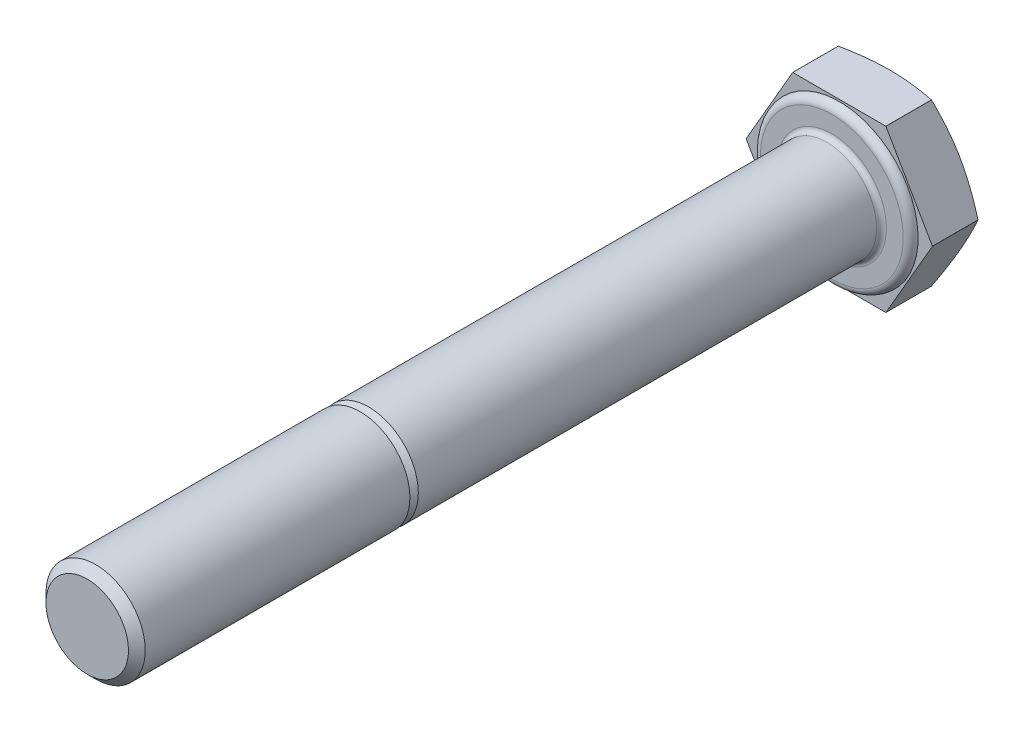
ISO-10303-21;
HEADER;
FILE_DESCRIPTION(('STEP AP214'),'2;1');
FILE_NAME('part.step','',(''),(''),'','','');
FILE_SCHEMA(('AUTOMOTIVE_DESIGN { 1 0 10303 214 1 1 1 1 }'));
ENDSEC;
DATA;
#1=APPLICATION_CONTEXT('core data for automotive mechanical design processes');
#2=APPLICATION_PROTOCOL_DEFINITION('international standard','automotive_design',2000,#1);
#3=PRODUCT_CONTEXT('',#1,'mechanical');
#4=PRODUCT('Part','Part','',(#3));
#5=PRODUCT_RELATED_PRODUCT_CATEGORY('part','',(#4));
#6=PRODUCT_DEFINITION_FORMATION('','',#4);
#7=PRODUCT_DEFINITION_CONTEXT('part definition',#1,'design');
#8=PRODUCT_DEFINITION('design','',#6,#7);
#9=PRODUCT_DEFINITION_SHAPE('','',#8);
#10=(LENGTH_UNIT() NAMED_UNIT(*) SI_UNIT(.MILLI.,.METRE.));
#11=(NAMED_UNIT(*) PLANE_ANGLE_UNIT() SI_UNIT($,.RADIAN.));
#12=(NAMED_UNIT(*) SI_UNIT($,.STERADIAN.) SOLID_ANGLE_UNIT());
#13=UNCERTAINTY_MEASURE_WITH_UNIT(LENGTH_MEASURE(1.E-05),#10,'distance_accuracy_value','');
#14=(GEOMETRIC_REPRESENTATION_CONTEXT(3) GLOBAL_UNCERTAINTY_ASSIGNED_CONTEXT((#13)) GLOBAL_UNIT_ASSIGNED_CONTEXT((#10,
#11,#12)) REPRESENTATION_CONTEXT('',''));
#15=CARTESIAN_POINT('',(0.,0.,0.));
#16=DIRECTION('',(0.,0.,1.));
#17=DIRECTION('',(1.,0.,0.));
#18=AXIS2_PLACEMENT_3D('',#15,#16,#17);
#19=CARTESIAN_POINT('',(0.,0.,37.66171875));
#20=DIRECTION('',(0.,0.,-1.));
#21=DIRECTION('',(1.,0.,0.));
#22=AXIS2_PLACEMENT_3D('',#19,#20,#21);
#23=CONICAL_SURFACE('',#22,3.66171875,0.785398163397449);
#24=CARTESIAN_POINT('',(0.,0.,37.3234375));
#25=DIRECTION('',(0.,0.,-1.));
#26=DIRECTION('',(0.,-1.,0.));
#27=AXIS2_PLACEMENT_3D('',#24,#25,#26);
#28=CIRCLE('',#27,4.);
#29=CARTESIAN_POINT('',(0.,-4.,37.3234375));
#30=VERTEX_POINT('',#29);
#31=EDGE_CURVE('E175',#30,#30,#28,.T.);
#32=ORIENTED_EDGE('',*,*,#31,.F.);
#33=EDGE_LOOP('',(#32));
#34=FACE_BOUND('',#33,.T.);
#35=CARTESIAN_POINT('',(0.,0.,38.));
#36=DIRECTION('',(0.,0.,1.));
#37=DIRECTION('',(1.,0.,0.));
#38=AXIS2_PLACEMENT_3D('',#35,#36,#37);
#39=CIRCLE('',#38,3.3234375);
#40=CARTESIAN_POINT('',(3.3234375,0.,38.));
#41=VERTEX_POINT('',#40);
#42=EDGE_CURVE('E11',#41,#41,#39,.T.);
#43=ORIENTED_EDGE('',*,*,#42,.F.);
#44=EDGE_LOOP('',(#43));
#45=FACE_BOUND('',#44,.T.);
#46=ADVANCED_FACE('F17',(#34,#45),#23,.T.);
#47=CARTESIAN_POINT('',(3.66171875,0.,38.));
#48=DIRECTION('',(0.,0.,1.));
#49=DIRECTION('',(0.,-1.,0.));
#50=AXIS2_PLACEMENT_3D('',#47,#48,#49);
#51=PLANE('',#50);
#52=ORIENTED_EDGE('',*,*,#42,.T.);
#53=EDGE_LOOP('',(#52));
#54=FACE_BOUND('',#53,.T.);
#55=CARTESIAN_POINT('',(0.,0.,38.));
#56=DIRECTION('',(0.,0.,1.));
#57=DIRECTION('',(0.,-1.,0.));
#58=AXIS2_PLACEMENT_3D('',#55,#56,#57);
#59=CIRCLE('',#58,4.);
#60=CARTESIAN_POINT('',(0.,-4.,38.));
#61=VERTEX_POINT('',#60);
#62=EDGE_CURVE('E25',#61,#61,#59,.T.);
#63=ORIENTED_EDGE('',*,*,#62,.F.);
#64=EDGE_LOOP('',(#63));
#65=FACE_BOUND('',#64,.T.);
#66=ADVANCED_FACE('F328',(#54,#65),#51,.F.);
#67=CARTESIAN_POINT('',(0.,0.,29.86171875));
#68=DIRECTION('',(0.,0.,-1.));
#69=DIRECTION('',(0.,-1.,0.));
#70=AXIS2_PLACEMENT_3D('',#67,#68,#69);
#71=CYLINDRICAL_SURFACE('',#70,4.);
#72=ORIENTED_EDGE('',*,*,#62,.T.);
#73=EDGE_LOOP('',(#72));
#74=FACE_BOUND('',#73,.T.);
#75=CARTESIAN_POINT('',(0.,0.,59.3234375));
#76=DIRECTION('',(0.,0.,1.));
#77=DIRECTION('',(0.,-1.,0.));
#78=AXIS2_PLACEMENT_3D('',#75,#76,#77);
#79=CIRCLE('',#78,4.);
#80=CARTESIAN_POINT('',(0.,-3.99999999999999,59.3234375));
#81=VERTEX_POINT('',#80);
#82=EDGE_CURVE('E421',#81,#81,#79,.T.);
#83=ORIENTED_EDGE('',*,*,#82,.F.);
#84=EDGE_LOOP('',(#83));
#85=FACE_BOUND('',#84,.T.);
#86=ADVANCED_FACE('F325',(#74,#85),#71,.T.);
#87=CARTESIAN_POINT('',(-5.630625,3.25084285945583,-4.7));
#88=DIRECTION('',(-0.866025403784439,0.5,0.));
#89=DIRECTION('',(0.,0.,1.));
#90=AXIS2_PLACEMENT_3D('',#87,#88,#89);
#91=PLANE('',#90);
#92=CARTESIAN_POINT('',(-3.75570076053057,6.49830690255932,-4.27272727272728));
#93=CARTESIAN_POINT('',(-5.630625,3.25084285945584,-5.0296551023286));
#94=CARTESIAN_POINT('',(-7.50554923946943,0.00337881635235375,-4.27272727272728));
#95=(BOUNDED_CURVE() B_SPLINE_CURVE(2,(#92,#93,#94),.UNSPECIFIED.,.F.,
.F.) B_SPLINE_CURVE_WITH_KNOTS((3,3),(0.,7.54343816373168),
.UNSPECIFIED.) CURVE() GEOMETRIC_REPRESENTATION_ITEM() RATIONAL_B_SPLINE_CURVE((1.,
1.15440061616149,1.)) REPRESENTATION_ITEM(''));
#96=CARTESIAN_POINT('',(-3.75570076053057,6.49830690255932,-4.27272727272728));
#97=VERTEX_POINT('',#96);
#98=CARTESIAN_POINT('',(-7.50554923946943,0.0033788163523533,-4.27272727272728));
#99=VERTEX_POINT('',#98);
#100=EDGE_CURVE('E143',#97,#99,#95,.T.);
#101=ORIENTED_EDGE('',*,*,#100,.T.);
#102=DIRECTION('',(0.,0.,1.));
#103=VECTOR('',#102,1.);
#104=CARTESIAN_POINT('',(-7.50554923946943,0.00337881635235485,-2.43636363636363));
#105=LINE('',#104,#103);
#106=CARTESIAN_POINT('',(-7.50554923946943,0.00337881635235508,-0.6));
#107=VERTEX_POINT('',#106);
#108=EDGE_CURVE('E137',#99,#107,#105,.T.);
#109=ORIENTED_EDGE('',*,*,#108,.T.);
#110=DIRECTION('',(0.5,0.866025403784439,0.));
#111=VECTOR('',#110,1.);
#112=CARTESIAN_POINT('',(-7.13053228542569,0.652927234455836,-0.6));
#113=LINE('',#112,#111);
#114=CARTESIAN_POINT('',(-3.75570076053057,6.49830690255932,-0.6));
#115=VERTEX_POINT('',#114);
#116=EDGE_CURVE('E141',#107,#115,#113,.T.);
#117=ORIENTED_EDGE('',*,*,#116,.T.);
#118=DIRECTION('',(0.,0.,-1.));
#119=VECTOR('',#118,1.);
#120=CARTESIAN_POINT('',(-3.75570076053057,6.49830690255932,-2.43636363636363));
#121=LINE('',#120,#119);
#122=EDGE_CURVE('E243',#115,#97,#121,.T.);
#123=ORIENTED_EDGE('',*,*,#122,.T.);
#124=EDGE_LOOP('',(#101,#109,#117,#123));
#125=FACE_BOUND('',#124,.T.);
#126=ADVANCED_FACE('F139',(#125),#91,.T.);
#127=CARTESIAN_POINT('',(0.,6.50168571891167,-4.7));
#128=DIRECTION('',(0.,1.,0.));
#129=DIRECTION('',(0.,0.,-1.));
#130=AXIS2_PLACEMENT_3D('',#127,#128,#129);
#131=PLANE('',#130);
#132=CARTESIAN_POINT('',(3.74984847893885,6.50168571891167,-4.27272727272728));
#133=CARTESIAN_POINT('',(0.,6.50168571891168,-5.02965510232861));
#134=CARTESIAN_POINT('',(-3.74984847893885,6.50168571891167,-4.27272727272728));
#135=(BOUNDED_CURVE() B_SPLINE_CURVE(2,(#132,#133,#134),.UNSPECIFIED.,.F.,
.F.) B_SPLINE_CURVE_WITH_KNOTS((3,3),(0.,7.54343816373169),
.UNSPECIFIED.) CURVE() GEOMETRIC_REPRESENTATION_ITEM() RATIONAL_B_SPLINE_CURVE((1.,
1.15440061616149,1.)) REPRESENTATION_ITEM(''));
#136=CARTESIAN_POINT('',(3.74984847893885,6.50168571891167,-4.27272727272728));
#137=VERTEX_POINT('',#136);
#138=CARTESIAN_POINT('',(-3.74984847893885,6.50168571891167,-4.27272727272728));
#139=VERTEX_POINT('',#138);
#140=EDGE_CURVE('E240',#137,#139,#135,.T.);
#141=ORIENTED_EDGE('',*,*,#140,.T.);
#142=DIRECTION('',(0.,0.,1.));
#143=VECTOR('',#142,1.);
#144=CARTESIAN_POINT('',(-3.74984847893885,6.50168571891167,-2.43636363636363));
#145=LINE('',#144,#143);
#146=CARTESIAN_POINT('',(-3.74984847893885,6.50168571891167,-0.6));
#147=VERTEX_POINT('',#146);
#148=EDGE_CURVE('E295',#139,#147,#145,.T.);
#149=ORIENTED_EDGE('',*,*,#148,.T.);
#150=DIRECTION('',(1.,0.,0.));
#151=VECTOR('',#150,1.);
#152=CARTESIAN_POINT('',(0.,6.50168571891167,-0.599999999999991));
#153=LINE('',#152,#151);
#154=CARTESIAN_POINT('',(3.74984847893885,6.50168571891167,-0.6));
#155=VERTEX_POINT('',#154);
#156=EDGE_CURVE('E219',#147,#155,#153,.T.);
#157=ORIENTED_EDGE('',*,*,#156,.T.);
#158=DIRECTION('',(0.,0.,-1.));
#159=VECTOR('',#158,1.);
#160=CARTESIAN_POINT('',(3.74984847893885,6.50168571891167,-2.43636363636364));
#161=LINE('',#160,#159);
#162=EDGE_CURVE('E307',#155,#137,#161,.T.);
#163=ORIENTED_EDGE('',*,*,#162,.T.);
#164=EDGE_LOOP('',(#141,#149,#157,#163));
#165=FACE_BOUND('',#164,.T.);
#166=ADVANCED_FACE('F342',(#165),#131,.T.);
#167=CARTESIAN_POINT('',(5.630625,3.25084285945583,-4.7));
#168=DIRECTION('',(0.866025403784439,0.5,0.));
#169=DIRECTION('',(0.,0.,-1.));
#170=AXIS2_PLACEMENT_3D('',#167,#168,#169);
#171=PLANE('',#170);
#172=CARTESIAN_POINT('',(7.50554923946943,0.00337881635235375,-4.27272727272728));
#173=CARTESIAN_POINT('',(5.630625,3.25084285945584,-5.0296551023286));
#174=CARTESIAN_POINT('',(3.75570076053058,6.49830690255932,-4.27272727272728));
#175=(BOUNDED_CURVE() B_SPLINE_CURVE(2,(#172,#173,#174),.UNSPECIFIED.,.F.,
.F.) B_SPLINE_CURVE_WITH_KNOTS((3,3),(0.,7.54343816373168),
.UNSPECIFIED.) CURVE() GEOMETRIC_REPRESENTATION_ITEM() RATIONAL_B_SPLINE_CURVE((1.,
1.15440061616149,1.)) REPRESENTATION_ITEM(''));
#176=CARTESIAN_POINT('',(7.50554923946943,0.00337881635235019,-4.27272727272728));
#177=VERTEX_POINT('',#176);
#178=CARTESIAN_POINT('',(3.75570076053057,6.49830690255932,-4.27272727272728));
#179=VERTEX_POINT('',#178);
#180=EDGE_CURVE('E188',#177,#179,#175,.T.);
#181=ORIENTED_EDGE('',*,*,#180,.T.);
#182=DIRECTION('',(0.,0.,1.));
#183=VECTOR('',#182,1.);
#184=CARTESIAN_POINT('',(3.75570076053057,6.49830690255932,-2.43636363636364));
#185=LINE('',#184,#183);
#186=CARTESIAN_POINT('',(3.75570076053058,6.49830690255932,-0.6));
#187=VERTEX_POINT('',#186);
#188=EDGE_CURVE('E310',#179,#187,#185,.T.);
#189=ORIENTED_EDGE('',*,*,#188,.T.);
#190=DIRECTION('',(0.5,-0.866025403784439,0.));
#191=VECTOR('',#190,1.);
#192=CARTESIAN_POINT('',(7.13053228542569,0.652927234455833,-0.6));
#193=LINE('',#192,#191);
#194=CARTESIAN_POINT('',(7.50554923946943,0.00337881635235197,-0.6));
#195=VERTEX_POINT('',#194);
#196=EDGE_CURVE('E203',#187,#195,#193,.T.);
#197=ORIENTED_EDGE('',*,*,#196,.T.);
#198=DIRECTION('',(0.,0.,-1.));
#199=VECTOR('',#198,1.);
#200=CARTESIAN_POINT('',(7.50554923946943,0.00337881635235175,-2.43636363636363));
#201=LINE('',#200,#199);
#202=EDGE_CURVE('E302',#195,#177,#201,.T.);
#203=ORIENTED_EDGE('',*,*,#202,.T.);
#204=EDGE_LOOP('',(#181,#189,#197,#203));
#205=FACE_BOUND('',#204,.T.);
#206=ADVANCED_FACE('F345',(#205),#171,.T.);
#207=CARTESIAN_POINT('',(5.630625,-3.25084285945583,-4.7));
#208=DIRECTION('',(0.866025403784439,-0.5,0.));
#209=DIRECTION('',(0.,0.,-1.));
#210=AXIS2_PLACEMENT_3D('',#207,#208,#209);
#211=PLANE('',#210);
#212=CARTESIAN_POINT('',(3.75570076053057,-6.49830690255932,-4.27272727272728));
#213=CARTESIAN_POINT('',(5.630625,-3.25084285945584,-5.0296551023286));
#214=CARTESIAN_POINT('',(7.50554923946943,-0.00337881635235766,-4.27272727272728));
#215=(BOUNDED_CURVE() B_SPLINE_CURVE(2,(#212,#213,#214),.UNSPECIFIED.,.F.,
.F.) B_SPLINE_CURVE_WITH_KNOTS((3,3),(0.,7.54343816373168),
.UNSPECIFIED.) CURVE() GEOMETRIC_REPRESENTATION_ITEM() RATIONAL_B_SPLINE_CURVE((1.,
1.15440061616149,1.)) REPRESENTATION_ITEM(''));
#216=CARTESIAN_POINT('',(3.75570076053057,-6.49830690255932,-4.27272727272728));
#217=VERTEX_POINT('',#216);
#218=CARTESIAN_POINT('',(7.50554923946943,-0.00337881635235657,-4.27272727272728));
#219=VERTEX_POINT('',#218);
#220=EDGE_CURVE('E258',#217,#219,#215,.T.);
#221=ORIENTED_EDGE('',*,*,#220,.T.);
#222=DIRECTION('',(0.,0.,1.));
#223=VECTOR('',#222,1.);
#224=CARTESIAN_POINT('',(7.50554923946943,-0.00337881635235767,-2.43636363636363));
#225=LINE('',#224,#223);
#226=CARTESIAN_POINT('',(7.50554923946943,-0.00337881635235745,-0.6));
#227=VERTEX_POINT('',#226);
#228=EDGE_CURVE('E299',#219,#227,#225,.T.);
#229=ORIENTED_EDGE('',*,*,#228,.T.);
#230=DIRECTION('',(-0.5,-0.866025403784439,0.));
#231=VECTOR('',#230,1.);
#232=CARTESIAN_POINT('',(4.13071771457431,-5.84875848445584,-0.6));
#233=LINE('',#232,#231);
#234=CARTESIAN_POINT('',(3.75570076053057,-6.49830690255932,-0.6));
#235=VERTEX_POINT('',#234);
#236=EDGE_CURVE('E212',#227,#235,#233,.T.);
#237=ORIENTED_EDGE('',*,*,#236,.T.);
#238=DIRECTION('',(0.,0.,-1.));
#239=VECTOR('',#238,1.);
#240=CARTESIAN_POINT('',(3.75570076053057,-6.49830690255932,-2.43636363636363));
#241=LINE('',#240,#239);
#242=EDGE_CURVE('E313',#235,#217,#241,.T.);
#243=ORIENTED_EDGE('',*,*,#242,.T.);
#244=EDGE_LOOP('',(#221,#229,#237,#243));
#245=FACE_BOUND('',#244,.T.);
#246=ADVANCED_FACE('F349',(#245),#211,.T.);
#247=CARTESIAN_POINT('',(0.,-6.50168571891167,-4.7));
#248=DIRECTION('',(0.,-1.,0.));
#249=DIRECTION('',(-1.,0.,0.));
#250=AXIS2_PLACEMENT_3D('',#247,#248,#249);
#251=PLANE('',#250);
#252=CARTESIAN_POINT('',(-3.74984847893885,-6.50168571891167,-4.27272727272727));
#253=CARTESIAN_POINT('',(0.,-6.50168571891168,-5.0296551023286));
#254=CARTESIAN_POINT('',(3.74984847893885,-6.50168571891167,-4.27272727272728));
#255=(BOUNDED_CURVE() B_SPLINE_CURVE(2,(#252,#253,#254),.UNSPECIFIED.,.F.,
.F.) B_SPLINE_CURVE_WITH_KNOTS((3,3),(0.,7.54343816373169),
.UNSPECIFIED.) CURVE() GEOMETRIC_REPRESENTATION_ITEM() RATIONAL_B_SPLINE_CURVE((1.,
1.15440061616149,1.)) REPRESENTATION_ITEM(''));
#256=CARTESIAN_POINT('',(-3.74984847893885,-6.50168571891167,-4.27272727272727));
#257=VERTEX_POINT('',#256);
#258=CARTESIAN_POINT('',(3.74984847893885,-6.50168571891167,-4.27272727272728));
#259=VERTEX_POINT('',#258);
#260=EDGE_CURVE('E271',#257,#259,#255,.T.);
#261=ORIENTED_EDGE('',*,*,#260,.T.);
#262=DIRECTION('',(0.,0.,1.));
#263=VECTOR('',#262,1.);
#264=CARTESIAN_POINT('',(3.74984847893885,-6.50168571891167,-2.43636363636363));
#265=LINE('',#264,#263);
#266=CARTESIAN_POINT('',(3.74984847893885,-6.50168571891167,-0.6));
#267=VERTEX_POINT('',#266);
#268=EDGE_CURVE('E316',#259,#267,#265,.T.);
#269=ORIENTED_EDGE('',*,*,#268,.T.);
#270=DIRECTION('',(-1.,0.,0.));
#271=VECTOR('',#270,1.);
#272=CARTESIAN_POINT('',(0.,-6.50168571891167,-0.6));
#273=LINE('',#272,#271);
#274=CARTESIAN_POINT('',(-3.74984847893885,-6.50168571891167,-0.6));
#275=VERTEX_POINT('',#274);
#276=EDGE_CURVE('E186',#267,#275,#273,.T.);
#277=ORIENTED_EDGE('',*,*,#276,.T.);
#278=DIRECTION('',(0.,0.,-1.));
#279=VECTOR('',#278,1.);
#280=CARTESIAN_POINT('',(-3.74984847893885,-6.50168571891167,-2.43636363636363));
#281=LINE('',#280,#279);
#282=EDGE_CURVE('E298',#275,#257,#281,.T.);
#283=ORIENTED_EDGE('',*,*,#282,.T.);
#284=EDGE_LOOP('',(#261,#269,#277,#283));
#285=FACE_BOUND('',#284,.T.);
#286=ADVANCED_FACE('F353',(#285),#251,.T.);
#287=CARTESIAN_POINT('',(-5.630625,-3.25084285945583,-4.7));
#288=DIRECTION('',(-0.866025403784439,-0.5,0.));
#289=DIRECTION('',(-0.5,0.866025403784439,0.));
#290=AXIS2_PLACEMENT_3D('',#287,#288,#289);
#291=PLANE('',#290);
#292=CARTESIAN_POINT('',(-7.50554923946943,-0.0033788163523548,-4.27272727272728));
#293=CARTESIAN_POINT('',(-5.630625,-3.25084285945584,-5.0296551023286));
#294=CARTESIAN_POINT('',(-3.75570076053057,-6.49830690255932,-4.27272727272727));
#295=(BOUNDED_CURVE() B_SPLINE_CURVE(2,(#292,#293,#294),.UNSPECIFIED.,.F.,
.F.) B_SPLINE_CURVE_WITH_KNOTS((3,3),(0.,7.54343816373168),
.UNSPECIFIED.) CURVE() GEOMETRIC_REPRESENTATION_ITEM() RATIONAL_B_SPLINE_CURVE((1.,
1.15440061616149,1.)) REPRESENTATION_ITEM(''));
#296=CARTESIAN_POINT('',(-7.50554923946943,-0.00337881635235435,-4.27272727272728));
#297=VERTEX_POINT('',#296);
#298=CARTESIAN_POINT('',(-3.75570076053057,-6.49830690255932,-4.27272727272727));
#299=VERTEX_POINT('',#298);
#300=EDGE_CURVE('E283',#297,#299,#295,.T.);
#301=ORIENTED_EDGE('',*,*,#300,.T.);
#302=DIRECTION('',(0.,0.,1.));
#303=VECTOR('',#302,1.);
#304=CARTESIAN_POINT('',(-3.75570076053057,-6.49830690255932,-2.43636363636363));
#305=LINE('',#304,#303);
#306=CARTESIAN_POINT('',(-3.75570076053057,-6.49830690255932,-0.6));
#307=VERTEX_POINT('',#306);
#308=EDGE_CURVE('E47',#299,#307,#305,.T.);
#309=ORIENTED_EDGE('',*,*,#308,.T.);
#310=DIRECTION('',(-0.5,0.866025403784439,0.));
#311=VECTOR('',#310,1.);
#312=CARTESIAN_POINT('',(-4.13071771457431,-5.84875848445584,-0.6));
#313=LINE('',#312,#311);
#314=CARTESIAN_POINT('',(-7.50554923946943,-0.00337881635235523,-0.6));
#315=VERTEX_POINT('',#314);
#316=EDGE_CURVE('E155',#307,#315,#313,.T.);
#317=ORIENTED_EDGE('',*,*,#316,.T.);
#318=DIRECTION('',(0.,0.,-1.));
#319=VECTOR('',#318,1.);
#320=CARTESIAN_POINT('',(-7.50554923946943,-0.00337881635235545,-2.43636363636363));
#321=LINE('',#320,#319);
#322=EDGE_CURVE('E37',#315,#297,#321,.T.);
#323=ORIENTED_EDGE('',*,*,#322,.T.);
#324=EDGE_LOOP('',(#301,#309,#317,#323));
#325=FACE_BOUND('',#324,.T.);
#326=ADVANCED_FACE('F357',(#325),#291,.T.);
#327=CARTESIAN_POINT('',(0.,0.,-2.43636363636363));
#328=DIRECTION('',(0.,0.,-1.));
#329=DIRECTION('',(0.,-1.,0.));
#330=AXIS2_PLACEMENT_3D('',#327,#328,#329);
#331=CYLINDRICAL_SURFACE('',#330,7.50555);
#332=ORIENTED_EDGE('',*,*,#202,.F.);
#333=CARTESIAN_POINT('',(0.,0.,-0.6));
#334=DIRECTION('',(0.,0.,1.));
#335=DIRECTION('',(0.,-1.,0.));
#336=AXIS2_PLACEMENT_3D('',#333,#334,#335);
#337=CIRCLE('',#336,7.50555);
#338=EDGE_CURVE('E208',#227,#195,#337,.T.);
#339=ORIENTED_EDGE('',*,*,#338,.F.);
#340=ORIENTED_EDGE('',*,*,#228,.F.);
#341=CARTESIAN_POINT('',(0.,0.,-4.27272727272728));
#342=DIRECTION('',(0.,0.,1.));
#343=DIRECTION('',(0.,-1.,0.));
#344=AXIS2_PLACEMENT_3D('',#341,#342,#343);
#345=CIRCLE('',#344,7.50555);
#346=EDGE_CURVE('E193',#219,#177,#345,.T.);
#347=ORIENTED_EDGE('',*,*,#346,.T.);
#348=EDGE_LOOP('',(#332,#339,#340,#347));
#349=FACE_BOUND('',#348,.T.);
#350=ADVANCED_FACE('F361',(#349),#331,.T.);
#351=CARTESIAN_POINT('',(0.,0.,-2.43636363636363));
#352=DIRECTION('',(0.,0.,-1.));
#353=DIRECTION('',(0.,-1.,0.));
#354=AXIS2_PLACEMENT_3D('',#351,#352,#353);
#355=CYLINDRICAL_SURFACE('',#354,7.50555);
#356=ORIENTED_EDGE('',*,*,#242,.F.);
#357=CARTESIAN_POINT('',(0.,0.,-0.6));
#358=DIRECTION('',(0.,0.,1.));
#359=DIRECTION('',(0.,-1.,0.));
#360=AXIS2_PLACEMENT_3D('',#357,#358,#359);
#361=CIRCLE('',#360,7.50555);
#362=EDGE_CURVE('E202',#267,#235,#361,.T.);
#363=ORIENTED_EDGE('',*,*,#362,.F.);
#364=ORIENTED_EDGE('',*,*,#268,.F.);
#365=CARTESIAN_POINT('',(0.,0.,-4.27272727272728));
#366=DIRECTION('',(0.,0.,1.));
#367=DIRECTION('',(0.,-1.,0.));
#368=AXIS2_PLACEMENT_3D('',#365,#366,#367);
#369=CIRCLE('',#368,7.50555);
#370=EDGE_CURVE('E264',#259,#217,#369,.T.);
#371=ORIENTED_EDGE('',*,*,#370,.T.);
#372=EDGE_LOOP('',(#356,#363,#364,#371));
#373=FACE_BOUND('',#372,.T.);
#374=ADVANCED_FACE('F364',(#373),#355,.T.);
#375=CARTESIAN_POINT('',(0.,0.,-2.43636363636363));
#376=DIRECTION('',(0.,0.,-1.));
#377=DIRECTION('',(0.,-1.,0.));
#378=AXIS2_PLACEMENT_3D('',#375,#376,#377);
#379=CYLINDRICAL_SURFACE('',#378,7.50555);
#380=ORIENTED_EDGE('',*,*,#162,.F.);
#381=CARTESIAN_POINT('',(0.,0.,-0.6));
#382=DIRECTION('',(0.,0.,1.));
#383=DIRECTION('',(0.,-1.,0.));
#384=AXIS2_PLACEMENT_3D('',#381,#382,#383);
#385=CIRCLE('',#384,7.50555);
#386=EDGE_CURVE('E207',#187,#155,#385,.T.);
#387=ORIENTED_EDGE('',*,*,#386,.F.);
#388=ORIENTED_EDGE('',*,*,#188,.F.);
#389=CARTESIAN_POINT('',(0.,0.,-4.27272727272728));
#390=DIRECTION('',(0.,0.,1.));
#391=DIRECTION('',(0.,-1.,0.));
#392=AXIS2_PLACEMENT_3D('',#389,#390,#391);
#393=CIRCLE('',#392,7.50555);
#394=EDGE_CURVE('E194',#179,#137,#393,.T.);
#395=ORIENTED_EDGE('',*,*,#394,.T.);
#396=EDGE_LOOP('',(#380,#387,#388,#395));
#397=FACE_BOUND('',#396,.T.);
#398=ADVANCED_FACE('F366',(#397),#379,.T.);
#399=CARTESIAN_POINT('',(0.,0.,-2.43636363636363));
#400=DIRECTION('',(0.,0.,-1.));
#401=DIRECTION('',(0.,-1.,0.));
#402=AXIS2_PLACEMENT_3D('',#399,#400,#401);
#403=CYLINDRICAL_SURFACE('',#402,7.50555);
#404=ORIENTED_EDGE('',*,*,#282,.F.);
#405=CARTESIAN_POINT('',(0.,0.,-0.6));
#406=DIRECTION('',(0.,0.,1.));
#407=DIRECTION('',(0.,-1.,0.));
#408=AXIS2_PLACEMENT_3D('',#405,#406,#407);
#409=CIRCLE('',#408,7.50555);
#410=EDGE_CURVE('E183',#307,#275,#409,.T.);
#411=ORIENTED_EDGE('',*,*,#410,.F.);
#412=ORIENTED_EDGE('',*,*,#308,.F.);
#413=CARTESIAN_POINT('',(0.,0.,-4.27272727272728));
#414=DIRECTION('',(0.,0.,1.));
#415=DIRECTION('',(0.,-1.,0.));
#416=AXIS2_PLACEMENT_3D('',#413,#414,#415);
#417=CIRCLE('',#416,7.50555);
#418=EDGE_CURVE('E277',#299,#257,#417,.T.);
#419=ORIENTED_EDGE('',*,*,#418,.T.);
#420=EDGE_LOOP('',(#404,#411,#412,#419));
#421=FACE_BOUND('',#420,.T.);
#422=ADVANCED_FACE('F369',(#421),#403,.T.);
#423=CARTESIAN_POINT('',(0.,0.,-2.43636363636363));
#424=DIRECTION('',(0.,0.,-1.));
#425=DIRECTION('',(0.,-1.,0.));
#426=AXIS2_PLACEMENT_3D('',#423,#424,#425);
#427=CYLINDRICAL_SURFACE('',#426,7.50555);
#428=ORIENTED_EDGE('',*,*,#122,.F.);
#429=CARTESIAN_POINT('',(0.,0.,-0.6));
#430=DIRECTION('',(0.,0.,1.));
#431=DIRECTION('',(0.,-1.,0.));
#432=AXIS2_PLACEMENT_3D('',#429,#430,#431);
#433=CIRCLE('',#432,7.50555);
#434=EDGE_CURVE('E162',#147,#115,#433,.T.);
#435=ORIENTED_EDGE('',*,*,#434,.F.);
#436=ORIENTED_EDGE('',*,*,#148,.F.);
#437=CARTESIAN_POINT('',(0.,0.,-4.27272727272728));
#438=DIRECTION('',(0.,0.,1.));
#439=DIRECTION('',(0.,-1.,0.));
#440=AXIS2_PLACEMENT_3D('',#437,#438,#439);
#441=CIRCLE('',#440,7.50555);
#442=EDGE_CURVE('E233',#139,#97,#441,.T.);
#443=ORIENTED_EDGE('',*,*,#442,.T.);
#444=EDGE_LOOP('',(#428,#435,#436,#443));
#445=FACE_BOUND('',#444,.T.);
#446=ADVANCED_FACE('F373',(#445),#427,.T.);
#447=CARTESIAN_POINT('',(0.,0.,-2.43636363636363));
#448=DIRECTION('',(0.,0.,-1.));
#449=DIRECTION('',(0.,-1.,0.));
#450=AXIS2_PLACEMENT_3D('',#447,#448,#449);
#451=CYLINDRICAL_SURFACE('',#450,7.50555);
#452=ORIENTED_EDGE('',*,*,#108,.F.);
#453=CARTESIAN_POINT('',(0.,0.,-4.27272727272728));
#454=DIRECTION('',(0.,0.,1.));
#455=DIRECTION('',(0.,-1.,0.));
#456=AXIS2_PLACEMENT_3D('',#453,#454,#455);
#457=CIRCLE('',#456,7.50555);
#458=EDGE_CURVE('E147',#99,#297,#457,.T.);
#459=ORIENTED_EDGE('',*,*,#458,.T.);
#460=ORIENTED_EDGE('',*,*,#322,.F.);
#461=CARTESIAN_POINT('',(0.,0.,-0.6));
#462=DIRECTION('',(0.,0.,1.));
#463=DIRECTION('',(0.,-1.,0.));
#464=AXIS2_PLACEMENT_3D('',#461,#462,#463);
#465=CIRCLE('',#464,7.50555);
#466=EDGE_CURVE('E150',#107,#315,#465,.T.);
#467=ORIENTED_EDGE('',*,*,#466,.F.);
#468=EDGE_LOOP('',(#452,#459,#460,#467));
#469=FACE_BOUND('',#468,.T.);
#470=ADVANCED_FACE('F151',(#469),#451,.T.);
#471=CARTESIAN_POINT('',(0.,0.,-4.48636363636364));
#472=DIRECTION('',(0.,0.,1.));
#473=DIRECTION('',(0.,-1.,0.));
#474=AXIS2_PLACEMENT_3D('',#471,#472,#473);
#475=CONICAL_SURFACE('',#474,6.97678144495198,1.18682389135614);
#476=CARTESIAN_POINT('',(0.,0.,-4.7));
#477=DIRECTION('',(0.,0.,1.));
#478=DIRECTION('',(0.,-1.,0.));
#479=AXIS2_PLACEMENT_3D('',#476,#477,#478);
#480=CIRCLE('',#479,6.44801288990395);
#481=CARTESIAN_POINT('',(0.,-6.44801288990395,-4.7));
#482=VERTEX_POINT('',#481);
#483=EDGE_CURVE('E225',#482,#482,#480,.T.);
#484=ORIENTED_EDGE('',*,*,#483,.T.);
#485=EDGE_LOOP('',(#484));
#486=FACE_BOUND('',#485,.T.);
#487=ORIENTED_EDGE('',*,*,#100,.F.);
#488=ORIENTED_EDGE('',*,*,#442,.F.);
#489=ORIENTED_EDGE('',*,*,#140,.F.);
#490=ORIENTED_EDGE('',*,*,#394,.F.);
#491=ORIENTED_EDGE('',*,*,#180,.F.);
#492=ORIENTED_EDGE('',*,*,#346,.F.);
#493=ORIENTED_EDGE('',*,*,#220,.F.);
#494=ORIENTED_EDGE('',*,*,#370,.F.);
#495=ORIENTED_EDGE('',*,*,#260,.F.);
#496=ORIENTED_EDGE('',*,*,#418,.F.);
#497=ORIENTED_EDGE('',*,*,#300,.F.);
#498=ORIENTED_EDGE('',*,*,#458,.F.);
#499=EDGE_LOOP('',(#487,#488,#489,#490,#491,#492,#493,#494,#495,#496,#497,#498));
#500=FACE_BOUND('',#499,.T.);
#501=ADVANCED_FACE('F372',(#486,#500),#475,.T.);
#502=CARTESIAN_POINT('',(0.,-3.22400644495197,-4.7));
#503=DIRECTION('',(0.,0.,-1.));
#504=DIRECTION('',(0.,-1.,0.));
#505=AXIS2_PLACEMENT_3D('',#502,#503,#504);
#506=PLANE('',#505);
#507=ORIENTED_EDGE('',*,*,#483,.F.);
#508=EDGE_LOOP('',(#507));
#509=FACE_BOUND('',#508,.T.);
#510=ADVANCED_FACE('F378',(#509),#506,.T.);
#511=CARTESIAN_POINT('',(0.,-6.927775,-0.6));
#512=DIRECTION('',(0.,0.,1.));
#513=DIRECTION('',(0.,-1.,0.));
#514=AXIS2_PLACEMENT_3D('',#511,#512,#513);
#515=PLANE('',#514);
#516=ORIENTED_EDGE('',*,*,#116,.F.);
#517=ORIENTED_EDGE('',*,*,#466,.T.);
#518=ORIENTED_EDGE('',*,*,#316,.F.);
#519=ORIENTED_EDGE('',*,*,#410,.T.);
#520=ORIENTED_EDGE('',*,*,#276,.F.);
#521=ORIENTED_EDGE('',*,*,#362,.T.);
#522=ORIENTED_EDGE('',*,*,#236,.F.);
#523=ORIENTED_EDGE('',*,*,#338,.T.);
#524=ORIENTED_EDGE('',*,*,#196,.F.);
#525=ORIENTED_EDGE('',*,*,#386,.T.);
#526=ORIENTED_EDGE('',*,*,#156,.F.);
#527=ORIENTED_EDGE('',*,*,#434,.T.);
#528=EDGE_LOOP('',(#516,#517,#518,#519,#520,#521,#522,#523,#524,#525,#526,#527));
#529=FACE_BOUND('',#528,.T.);
#530=CARTESIAN_POINT('',(0.,0.,-0.6));
#531=DIRECTION('',(0.,0.,1.));
#532=DIRECTION('',(0.,-1.,0.));
#533=AXIS2_PLACEMENT_3D('',#530,#531,#532);
#534=CIRCLE('',#533,6.35);
#535=CARTESIAN_POINT('',(0.,-6.35,-0.599999999999999));
#536=VERTEX_POINT('',#535);
#537=EDGE_CURVE('E164',#536,#536,#534,.T.);
#538=ORIENTED_EDGE('',*,*,#537,.F.);
#539=EDGE_LOOP('',(#538));
#540=FACE_BOUND('',#539,.T.);
#541=ADVANCED_FACE('F158',(#529,#540),#515,.T.);
#542=CARTESIAN_POINT('',(0.,0.,-0.6));
#543=DIRECTION('',(0.,0.,1.));
#544=DIRECTION('',(-1.,0.,0.));
#545=AXIS2_PLACEMENT_3D('',#542,#543,#544);
#546=TOROIDAL_SURFACE('',#545,5.75,0.6);
#547=CARTESIAN_POINT('',(0.,0.,0.));
#548=DIRECTION('',(0.,0.,1.));
#549=DIRECTION('',(0.,-1.,0.));
#550=AXIS2_PLACEMENT_3D('',#547,#548,#549);
#551=CIRCLE('',#550,5.75);
#552=CARTESIAN_POINT('',(0.,-5.75,0.));
#553=VERTEX_POINT('',#552);
#554=EDGE_CURVE('E171',#553,#553,#551,.T.);
#555=ORIENTED_EDGE('',*,*,#554,.F.);
#556=EDGE_LOOP('',(#555));
#557=FACE_BOUND('',#556,.T.);
#558=ORIENTED_EDGE('',*,*,#537,.T.);
#559=EDGE_LOOP('',(#558));
#560=FACE_BOUND('',#559,.T.);
#561=ADVANCED_FACE('F377',(#557,#560),#546,.T.);
#562=CARTESIAN_POINT('',(0.,-5.075,0.));
#563=DIRECTION('',(0.,0.,1.));
#564=DIRECTION('',(0.,-1.,0.));
#565=AXIS2_PLACEMENT_3D('',#562,#563,#564);
#566=PLANE('',#565);
#567=CARTESIAN_POINT('',(0.,0.,0.));
#568=DIRECTION('',(0.,0.,1.));
#569=DIRECTION('',(0.,-1.,0.));
#570=AXIS2_PLACEMENT_3D('',#567,#568,#569);
#571=CIRCLE('',#570,4.4);
#572=CARTESIAN_POINT('',(0.,-4.4,0.));
#573=VERTEX_POINT('',#572);
#574=EDGE_CURVE('E177',#573,#573,#571,.T.);
#575=ORIENTED_EDGE('',*,*,#574,.F.);
#576=EDGE_LOOP('',(#575));
#577=FACE_BOUND('',#576,.T.);
#578=ORIENTED_EDGE('',*,*,#554,.T.);
#579=EDGE_LOOP('',(#578));
#580=FACE_BOUND('',#579,.T.);
#581=ADVANCED_FACE('F381',(#577,#580),#566,.T.);
#582=CARTESIAN_POINT('',(0.,0.,0.4));
#583=DIRECTION('',(0.,0.,1.));
#584=DIRECTION('',(-1.,0.,0.));
#585=AXIS2_PLACEMENT_3D('',#582,#583,#584);
#586=TOROIDAL_SURFACE('',#585,4.4,0.4);
#587=CARTESIAN_POINT('',(0.,0.,0.4));
#588=DIRECTION('',(0.,0.,1.));
#589=DIRECTION('',(0.,-1.,0.));
#590=AXIS2_PLACEMENT_3D('',#587,#588,#589);
#591=CIRCLE('',#590,4.);
#592=CARTESIAN_POINT('',(0.,-4.,0.400000000000001));
#593=VERTEX_POINT('',#592);
#594=EDGE_CURVE('E427',#593,#593,#591,.T.);
#595=ORIENTED_EDGE('',*,*,#594,.F.);
#596=EDGE_LOOP('',(#595));
#597=FACE_BOUND('',#596,.T.);
#598=ORIENTED_EDGE('',*,*,#574,.T.);
#599=EDGE_LOOP('',(#598));
#600=FACE_BOUND('',#599,.T.);
#601=ADVANCED_FACE('F391',(#597,#600),#586,.F.);
#602=CARTESIAN_POINT('',(0.,0.,29.86171875));
#603=DIRECTION('',(0.,0.,-1.));
#604=DIRECTION('',(0.,-1.,0.));
#605=AXIS2_PLACEMENT_3D('',#602,#603,#604);
#606=CYLINDRICAL_SURFACE('',#605,4.);
#607=ORIENTED_EDGE('',*,*,#31,.T.);
#608=EDGE_LOOP('',(#607));
#609=FACE_BOUND('',#608,.T.);
#610=ORIENTED_EDGE('',*,*,#594,.T.);
#611=EDGE_LOOP('',(#610));
#612=FACE_BOUND('',#611,.T.);
#613=ADVANCED_FACE('F401',(#609,#612),#606,.T.);
#614=CARTESIAN_POINT('',(0.,0.,59.66171875));
#615=DIRECTION('',(0.,0.,-1.));
#616=DIRECTION('',(0.,-1.,0.));
#617=AXIS2_PLACEMENT_3D('',#614,#615,#616);
#618=CONICAL_SURFACE('',#617,3.66171875,0.785398163397436);
#619=CARTESIAN_POINT('',(0.,0.,60.));
#620=DIRECTION('',(0.,0.,1.));
#621=DIRECTION('',(0.,-1.,0.));
#622=AXIS2_PLACEMENT_3D('',#619,#620,#621);
#623=CIRCLE('',#622,3.3234375);
#624=CARTESIAN_POINT('',(0.,-3.32343749999999,60.));
#625=VERTEX_POINT('',#624);
#626=EDGE_CURVE('E419',#625,#625,#623,.T.);
#627=ORIENTED_EDGE('',*,*,#626,.F.);
#628=EDGE_LOOP('',(#627));
#629=FACE_BOUND('',#628,.T.);
#630=ORIENTED_EDGE('',*,*,#82,.T.);
#631=EDGE_LOOP('',(#630));
#632=FACE_BOUND('',#631,.T.);
#633=ADVANCED_FACE('F405',(#629,#632),#618,.T.);
#634=CARTESIAN_POINT('',(0.,-1.66171875,60.));
#635=DIRECTION('',(0.,0.,1.));
#636=DIRECTION('',(0.,-1.,0.));
#637=AXIS2_PLACEMENT_3D('',#634,#635,#636);
#638=PLANE('',#637);
#639=ORIENTED_EDGE('',*,*,#626,.T.);
#640=EDGE_LOOP('',(#639));
#641=FACE_BOUND('',#640,.T.);
#642=ADVANCED_FACE('F408',(#641),#638,.T.);
#643=CLOSED_SHELL('',(#46,#66,#86,#126,#166,#206,#246,#286,#326,#350,#374,#398,#422,#446,#470,
#501,#510,#541,#561,#581,#601,#613,#633,#642));
#644=MANIFOLD_SOLID_BREP('B1',#643);
#645=ADVANCED_BREP_SHAPE_REPRESENTATION('',(#18,#644),#14);
#646=SHAPE_DEFINITION_REPRESENTATION(#9,#645);
ENDSEC;
END-ISO-10303-21;
